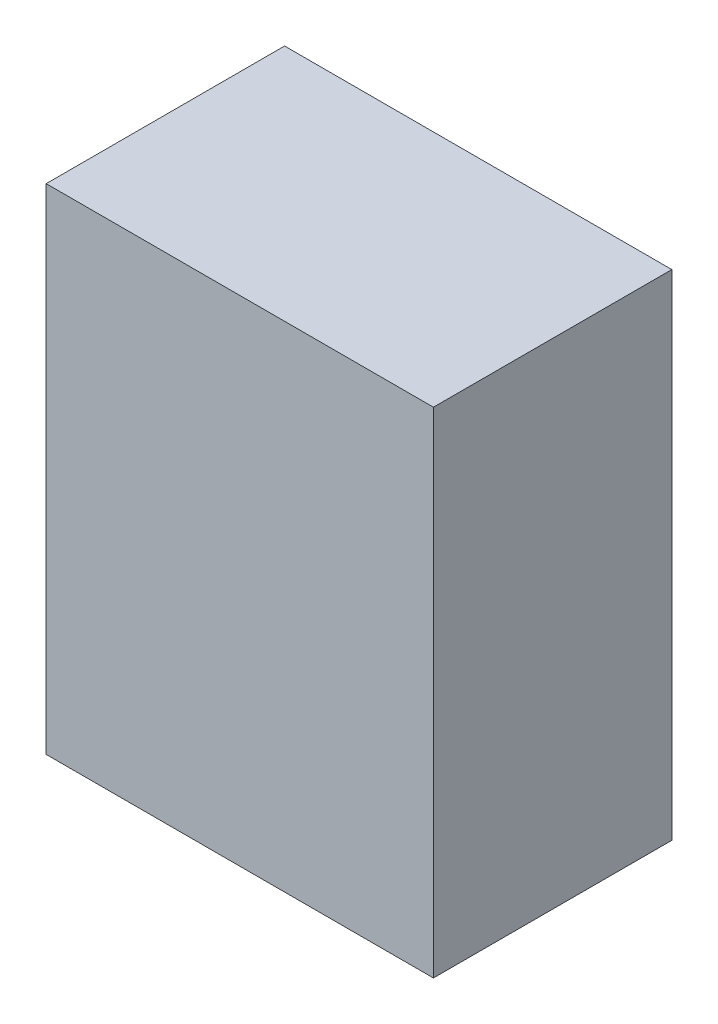
ISO-10303-21;
HEADER;
FILE_DESCRIPTION(('STEP AP214'),'2;1');
FILE_NAME('part.step','',(''),(''),'','','');
FILE_SCHEMA(('AUTOMOTIVE_DESIGN { 1 0 10303 214 1 1 1 1 }'));
ENDSEC;
DATA;
#1=APPLICATION_CONTEXT('core data for automotive mechanical design processes');
#2=APPLICATION_PROTOCOL_DEFINITION('international standard','automotive_design',2000,#1);
#3=PRODUCT_CONTEXT('',#1,'mechanical');
#4=PRODUCT('Part','Part','',(#3));
#5=PRODUCT_RELATED_PRODUCT_CATEGORY('part','',(#4));
#6=PRODUCT_DEFINITION_FORMATION('','',#4);
#7=PRODUCT_DEFINITION_CONTEXT('part definition',#1,'design');
#8=PRODUCT_DEFINITION('design','',#6,#7);
#9=PRODUCT_DEFINITION_SHAPE('','',#8);
#10=(LENGTH_UNIT() NAMED_UNIT(*) SI_UNIT(.MILLI.,.METRE.));
#11=(NAMED_UNIT(*) PLANE_ANGLE_UNIT() SI_UNIT($,.RADIAN.));
#12=(NAMED_UNIT(*) SI_UNIT($,.STERADIAN.) SOLID_ANGLE_UNIT());
#13=UNCERTAINTY_MEASURE_WITH_UNIT(LENGTH_MEASURE(1.E-05),#10,'distance_accuracy_value','');
#14=(GEOMETRIC_REPRESENTATION_CONTEXT(3) GLOBAL_UNCERTAINTY_ASSIGNED_CONTEXT((#13)) GLOBAL_UNIT_ASSIGNED_CONTEXT((#10,
#11,#12)) REPRESENTATION_CONTEXT('',''));
#15=CARTESIAN_POINT('',(0.,0.,0.));
#16=DIRECTION('',(0.,0.,1.));
#17=DIRECTION('',(1.,0.,0.));
#18=AXIS2_PLACEMENT_3D('',#15,#16,#17);
#19=CARTESIAN_POINT('',(0.,-165.882818936027,80.));
#20=DIRECTION('',(1.,0.,0.));
#21=DIRECTION('',(0.,0.,-1.));
#22=AXIS2_PLACEMENT_3D('',#19,#20,#21);
#23=PLANE('',#22);
#24=DIRECTION('',(0.,-1.,0.));
#25=VECTOR('',#24,1.);
#26=CARTESIAN_POINT('',(0.,-165.882818936027,0.));
#27=LINE('',#26,#25);
#28=CARTESIAN_POINT('',(0.,0.,0.));
#29=VERTEX_POINT('',#28);
#30=CARTESIAN_POINT('',(0.,-165.882818936027,0.));
#31=VERTEX_POINT('',#30);
#32=EDGE_CURVE('E107',#29,#31,#27,.T.);
#33=ORIENTED_EDGE('',*,*,#32,.T.);
#34=DIRECTION('',(0.,0.,-1.));
#35=VECTOR('',#34,1.);
#36=CARTESIAN_POINT('',(0.,-165.882818936027,80.));
#37=LINE('',#36,#35);
#38=CARTESIAN_POINT('',(0.,-165.882818936027,80.));
#39=VERTEX_POINT('',#38);
#40=EDGE_CURVE('E11',#39,#31,#37,.T.);
#41=ORIENTED_EDGE('',*,*,#40,.F.);
#42=DIRECTION('',(0.,-1.,0.));
#43=VECTOR('',#42,1.);
#44=CARTESIAN_POINT('',(0.,-165.882818936027,80.));
#45=LINE('',#44,#43);
#46=CARTESIAN_POINT('',(0.,0.,80.));
#47=VERTEX_POINT('',#46);
#48=EDGE_CURVE('E91',#47,#39,#45,.T.);
#49=ORIENTED_EDGE('',*,*,#48,.F.);
#50=DIRECTION('',(0.,0.,-1.));
#51=VECTOR('',#50,1.);
#52=CARTESIAN_POINT('',(0.,0.,80.));
#53=LINE('',#52,#51);
#54=EDGE_CURVE('E103',#47,#29,#53,.T.);
#55=ORIENTED_EDGE('',*,*,#54,.T.);
#56=EDGE_LOOP('',(#33,#41,#49,#55));
#57=FACE_BOUND('',#56,.T.);
#58=ADVANCED_FACE('F39',(#57),#23,.F.);
#59=CARTESIAN_POINT('',(129.942193247566,-165.882818936027,80.));
#60=DIRECTION('',(0.,1.,0.));
#61=DIRECTION('',(0.,0.,1.));
#62=AXIS2_PLACEMENT_3D('',#59,#60,#61);
#63=PLANE('',#62);
#64=DIRECTION('',(1.,0.,0.));
#65=VECTOR('',#64,1.);
#66=CARTESIAN_POINT('',(129.942193247566,-165.882818936027,0.));
#67=LINE('',#66,#65);
#68=CARTESIAN_POINT('',(129.942193247566,-165.882818936027,0.));
#69=VERTEX_POINT('',#68);
#70=EDGE_CURVE('E96',#31,#69,#67,.T.);
#71=ORIENTED_EDGE('',*,*,#70,.T.);
#72=DIRECTION('',(0.,0.,-1.));
#73=VECTOR('',#72,1.);
#74=CARTESIAN_POINT('',(129.942193247566,-165.882818936027,80.));
#75=LINE('',#74,#73);
#76=CARTESIAN_POINT('',(129.942193247566,-165.882818936027,80.));
#77=VERTEX_POINT('',#76);
#78=EDGE_CURVE('E48',#77,#69,#75,.T.);
#79=ORIENTED_EDGE('',*,*,#78,.F.);
#80=DIRECTION('',(1.,0.,0.));
#81=VECTOR('',#80,1.);
#82=CARTESIAN_POINT('',(129.942193247566,-165.882818936027,80.));
#83=LINE('',#82,#81);
#84=EDGE_CURVE('E86',#39,#77,#83,.T.);
#85=ORIENTED_EDGE('',*,*,#84,.F.);
#86=ORIENTED_EDGE('',*,*,#40,.T.);
#87=EDGE_LOOP('',(#71,#79,#85,#86));
#88=FACE_BOUND('',#87,.T.);
#89=ADVANCED_FACE('F95',(#88),#63,.F.);
#90=CARTESIAN_POINT('',(129.942193247566,0.,80.));
#91=DIRECTION('',(-1.,0.,0.));
#92=DIRECTION('',(0.,0.,1.));
#93=AXIS2_PLACEMENT_3D('',#90,#91,#92);
#94=PLANE('',#93);
#95=DIRECTION('',(0.,1.,0.));
#96=VECTOR('',#95,1.);
#97=CARTESIAN_POINT('',(129.942193247566,0.,0.));
#98=LINE('',#97,#96);
#99=CARTESIAN_POINT('',(129.942193247566,0.,0.));
#100=VERTEX_POINT('',#99);
#101=EDGE_CURVE('E73',#69,#100,#98,.T.);
#102=ORIENTED_EDGE('',*,*,#101,.T.);
#103=DIRECTION('',(0.,0.,-1.));
#104=VECTOR('',#103,1.);
#105=CARTESIAN_POINT('',(129.942193247566,0.,80.));
#106=LINE('',#105,#104);
#107=CARTESIAN_POINT('',(129.942193247566,0.,80.));
#108=VERTEX_POINT('',#107);
#109=EDGE_CURVE('E98',#108,#100,#106,.T.);
#110=ORIENTED_EDGE('',*,*,#109,.F.);
#111=DIRECTION('',(0.,1.,0.));
#112=VECTOR('',#111,1.);
#113=CARTESIAN_POINT('',(129.942193247566,0.,80.));
#114=LINE('',#113,#112);
#115=EDGE_CURVE('E89',#77,#108,#114,.T.);
#116=ORIENTED_EDGE('',*,*,#115,.F.);
#117=ORIENTED_EDGE('',*,*,#78,.T.);
#118=EDGE_LOOP('',(#102,#110,#116,#117));
#119=FACE_BOUND('',#118,.T.);
#120=ADVANCED_FACE('F99',(#119),#94,.F.);
#121=CARTESIAN_POINT('',(0.,0.,80.));
#122=DIRECTION('',(0.,-1.,0.));
#123=DIRECTION('',(0.,0.,-1.));
#124=AXIS2_PLACEMENT_3D('',#121,#122,#123);
#125=PLANE('',#124);
#126=DIRECTION('',(-1.,0.,0.));
#127=VECTOR('',#126,1.);
#128=CARTESIAN_POINT('',(0.,0.,0.));
#129=LINE('',#128,#127);
#130=EDGE_CURVE('E79',#100,#29,#129,.T.);
#131=ORIENTED_EDGE('',*,*,#130,.T.);
#132=ORIENTED_EDGE('',*,*,#54,.F.);
#133=DIRECTION('',(-1.,0.,0.));
#134=VECTOR('',#133,1.);
#135=CARTESIAN_POINT('',(0.,0.,80.));
#136=LINE('',#135,#134);
#137=EDGE_CURVE('E56',#108,#47,#136,.T.);
#138=ORIENTED_EDGE('',*,*,#137,.F.);
#139=ORIENTED_EDGE('',*,*,#109,.T.);
#140=EDGE_LOOP('',(#131,#132,#138,#139));
#141=FACE_BOUND('',#140,.T.);
#142=ADVANCED_FACE('F120',(#141),#125,.F.);
#143=CARTESIAN_POINT('',(0.,0.,80.));
#144=DIRECTION('',(0.,0.,-1.));
#145=DIRECTION('',(-1.,0.,0.));
#146=AXIS2_PLACEMENT_3D('',#143,#144,#145);
#147=PLANE('',#146);
#148=ORIENTED_EDGE('',*,*,#48,.T.);
#149=ORIENTED_EDGE('',*,*,#84,.T.);
#150=ORIENTED_EDGE('',*,*,#115,.T.);
#151=ORIENTED_EDGE('',*,*,#137,.T.);
#152=EDGE_LOOP('',(#148,#149,#150,#151));
#153=FACE_BOUND('',#152,.T.);
#154=ADVANCED_FACE('F87',(#153),#147,.F.);
#155=CARTESIAN_POINT('',(0.,0.,0.));
#156=DIRECTION('',(0.,0.,-1.));
#157=DIRECTION('',(-1.,0.,0.));
#158=AXIS2_PLACEMENT_3D('',#155,#156,#157);
#159=PLANE('',#158);
#160=ORIENTED_EDGE('',*,*,#32,.F.);
#161=ORIENTED_EDGE('',*,*,#130,.F.);
#162=ORIENTED_EDGE('',*,*,#101,.F.);
#163=ORIENTED_EDGE('',*,*,#70,.F.);
#164=EDGE_LOOP('',(#160,#161,#162,#163));
#165=FACE_BOUND('',#164,.T.);
#166=ADVANCED_FACE('F123',(#165),#159,.T.);
#167=CLOSED_SHELL('',(#58,#89,#120,#142,#154,#166));
#168=MANIFOLD_SOLID_BREP('B2',#167);
#169=ADVANCED_BREP_SHAPE_REPRESENTATION('',(#18,#168),#14);
#170=SHAPE_DEFINITION_REPRESENTATION(#9,#169);
ENDSEC;
END-ISO-10303-21;
